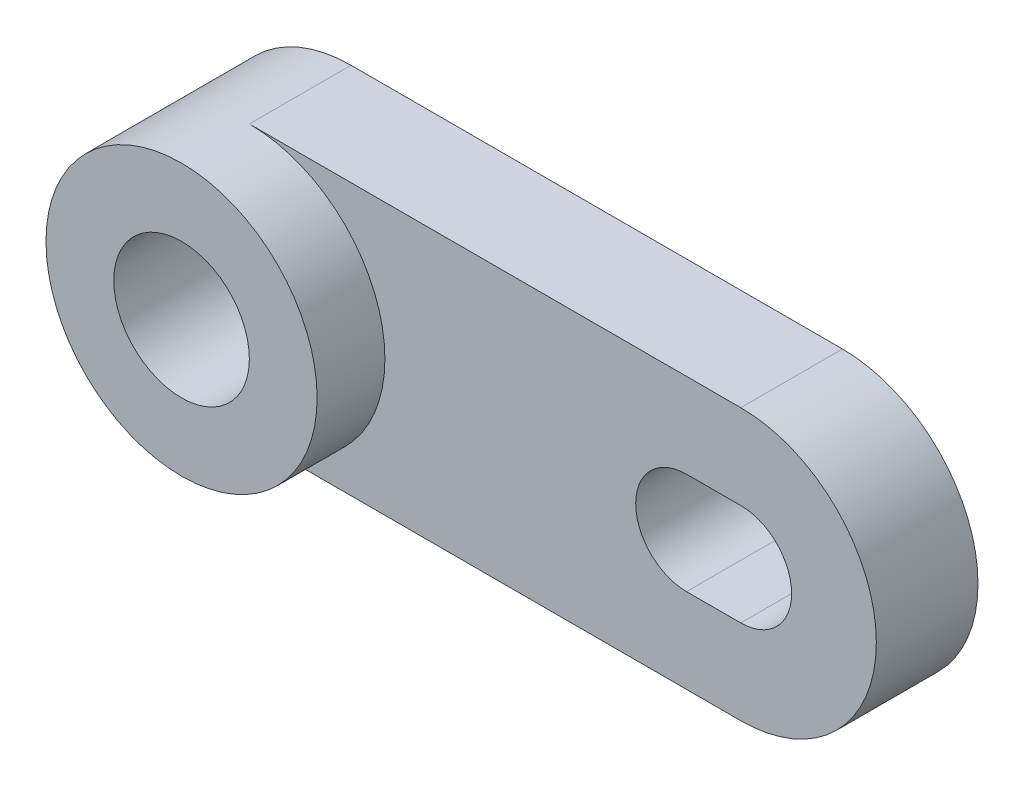
ISO-10303-21;
HEADER;
FILE_DESCRIPTION(('STEP AP214'),'2;1');
FILE_NAME('part.step','',(''),(''),'','','');
FILE_SCHEMA(('AUTOMOTIVE_DESIGN { 1 0 10303 214 1 1 1 1 }'));
ENDSEC;
DATA;
#1=APPLICATION_CONTEXT('core data for automotive mechanical design processes');
#2=APPLICATION_PROTOCOL_DEFINITION('international standard','automotive_design',2000,#1);
#3=PRODUCT_CONTEXT('',#1,'mechanical');
#4=PRODUCT('Part','Part','',(#3));
#5=PRODUCT_RELATED_PRODUCT_CATEGORY('part','',(#4));
#6=PRODUCT_DEFINITION_FORMATION('','',#4);
#7=PRODUCT_DEFINITION_CONTEXT('part definition',#1,'design');
#8=PRODUCT_DEFINITION('design','',#6,#7);
#9=PRODUCT_DEFINITION_SHAPE('','',#8);
#10=(LENGTH_UNIT() NAMED_UNIT(*) SI_UNIT(.MILLI.,.METRE.));
#11=(NAMED_UNIT(*) PLANE_ANGLE_UNIT() SI_UNIT($,.RADIAN.));
#12=(NAMED_UNIT(*) SI_UNIT($,.STERADIAN.) SOLID_ANGLE_UNIT());
#13=UNCERTAINTY_MEASURE_WITH_UNIT(LENGTH_MEASURE(1.E-05),#10,'distance_accuracy_value','');
#14=(GEOMETRIC_REPRESENTATION_CONTEXT(3) GLOBAL_UNCERTAINTY_ASSIGNED_CONTEXT((#13)) GLOBAL_UNIT_ASSIGNED_CONTEXT((#10,
#11,#12)) REPRESENTATION_CONTEXT('',''));
#15=CARTESIAN_POINT('',(0.,0.,0.));
#16=DIRECTION('',(0.,0.,1.));
#17=DIRECTION('',(1.,0.,0.));
#18=AXIS2_PLACEMENT_3D('',#15,#16,#17);
#19=CARTESIAN_POINT('',(0.,0.,3.));
#20=DIRECTION('',(0.,0.,-1.));
#21=DIRECTION('',(-1.,0.,0.));
#22=AXIS2_PLACEMENT_3D('',#19,#20,#21);
#23=CYLINDRICAL_SURFACE('',#22,2.);
#24=CARTESIAN_POINT('',(0.,0.,5.));
#25=DIRECTION('',(0.,0.,1.));
#26=DIRECTION('',(1.,0.,0.));
#27=AXIS2_PLACEMENT_3D('',#24,#25,#26);
#28=CIRCLE('',#27,2.);
#29=CARTESIAN_POINT('',(2.,0.,5.));
#30=VERTEX_POINT('',#29);
#31=EDGE_CURVE('E321',#30,#30,#28,.T.);
#32=ORIENTED_EDGE('',*,*,#31,.T.);
#33=EDGE_LOOP('',(#32));
#34=FACE_BOUND('',#33,.T.);
#35=CARTESIAN_POINT('',(0.,0.,2.));
#36=DIRECTION('',(0.,0.,-1.));
#37=DIRECTION('',(-1.,0.,0.));
#38=AXIS2_PLACEMENT_3D('',#35,#36,#37);
#39=CIRCLE('',#38,2.);
#40=CARTESIAN_POINT('',(-2.,0.,2.));
#41=VERTEX_POINT('',#40);
#42=EDGE_CURVE('E39',#41,#41,#39,.T.);
#43=ORIENTED_EDGE('',*,*,#42,.T.);
#44=EDGE_LOOP('',(#43));
#45=FACE_BOUND('',#44,.T.);
#46=ADVANCED_FACE('F35',(#34,#45),#23,.F.);
#47=CARTESIAN_POINT('',(12.9,0.,3.));
#48=DIRECTION('',(0.,0.,-1.));
#49=DIRECTION('',(-1.,0.,0.));
#50=AXIS2_PLACEMENT_3D('',#47,#48,#49);
#51=CYLINDRICAL_SURFACE('',#50,1.5);
#52=CARTESIAN_POINT('',(12.9,0.,0.));
#53=DIRECTION('',(0.,0.,1.));
#54=DIRECTION('',(1.,0.,0.));
#55=AXIS2_PLACEMENT_3D('',#52,#53,#54);
#56=CIRCLE('',#55,1.5);
#57=CARTESIAN_POINT('',(12.9,1.5,0.));
#58=VERTEX_POINT('',#57);
#59=CARTESIAN_POINT('',(12.9,-1.5,0.));
#60=VERTEX_POINT('',#59);
#61=EDGE_CURVE('E142',#58,#60,#56,.T.);
#62=ORIENTED_EDGE('',*,*,#61,.F.);
#63=DIRECTION('',(0.,0.,-1.));
#64=VECTOR('',#63,1.);
#65=CARTESIAN_POINT('',(12.9,1.5,3.));
#66=LINE('',#65,#64);
#67=CARTESIAN_POINT('',(12.9,1.5,3.));
#68=VERTEX_POINT('',#67);
#69=EDGE_CURVE('E45',#68,#58,#66,.T.);
#70=ORIENTED_EDGE('',*,*,#69,.F.);
#71=CARTESIAN_POINT('',(12.9,0.,3.));
#72=DIRECTION('',(0.,0.,1.));
#73=DIRECTION('',(1.,0.,0.));
#74=AXIS2_PLACEMENT_3D('',#71,#72,#73);
#75=CIRCLE('',#74,1.5);
#76=CARTESIAN_POINT('',(12.9,-1.5,3.));
#77=VERTEX_POINT('',#76);
#78=EDGE_CURVE('E113',#68,#77,#75,.T.);
#79=ORIENTED_EDGE('',*,*,#78,.T.);
#80=DIRECTION('',(0.,0.,-1.));
#81=VECTOR('',#80,1.);
#82=CARTESIAN_POINT('',(12.9,-1.5,3.));
#83=LINE('',#82,#81);
#84=EDGE_CURVE('E54',#77,#60,#83,.T.);
#85=ORIENTED_EDGE('',*,*,#84,.T.);
#86=EDGE_LOOP('',(#62,#70,#79,#85));
#87=FACE_BOUND('',#86,.T.);
#88=ADVANCED_FACE('F187',(#87),#51,.F.);
#89=CARTESIAN_POINT('',(0.,1.5,3.));
#90=DIRECTION('',(0.,1.,0.));
#91=DIRECTION('',(0.,0.,1.));
#92=AXIS2_PLACEMENT_3D('',#89,#90,#91);
#93=PLANE('',#92);
#94=DIRECTION('',(1.,0.,0.));
#95=VECTOR('',#94,1.);
#96=CARTESIAN_POINT('',(0.,1.5,0.));
#97=LINE('',#96,#95);
#98=CARTESIAN_POINT('',(14.5,1.5,0.));
#99=VERTEX_POINT('',#98);
#100=EDGE_CURVE('E120',#58,#99,#97,.T.);
#101=ORIENTED_EDGE('',*,*,#100,.T.);
#102=DIRECTION('',(0.,0.,-1.));
#103=VECTOR('',#102,1.);
#104=CARTESIAN_POINT('',(14.5,1.5,3.));
#105=LINE('',#104,#103);
#106=CARTESIAN_POINT('',(14.5,1.5,3.));
#107=VERTEX_POINT('',#106);
#108=EDGE_CURVE('E117',#107,#99,#105,.T.);
#109=ORIENTED_EDGE('',*,*,#108,.F.);
#110=DIRECTION('',(1.,0.,0.));
#111=VECTOR('',#110,1.);
#112=CARTESIAN_POINT('',(0.,1.5,3.));
#113=LINE('',#112,#111);
#114=EDGE_CURVE('E107',#68,#107,#113,.T.);
#115=ORIENTED_EDGE('',*,*,#114,.F.);
#116=ORIENTED_EDGE('',*,*,#69,.T.);
#117=EDGE_LOOP('',(#101,#109,#115,#116));
#118=FACE_BOUND('',#117,.T.);
#119=ADVANCED_FACE('F118',(#118),#93,.F.);
#120=CARTESIAN_POINT('',(14.5,0.,3.));
#121=DIRECTION('',(0.,0.,-1.));
#122=DIRECTION('',(-1.,0.,0.));
#123=AXIS2_PLACEMENT_3D('',#120,#121,#122);
#124=CYLINDRICAL_SURFACE('',#123,1.5);
#125=CARTESIAN_POINT('',(14.5,0.,0.));
#126=DIRECTION('',(0.,0.,1.));
#127=DIRECTION('',(1.,0.,0.));
#128=AXIS2_PLACEMENT_3D('',#125,#126,#127);
#129=CIRCLE('',#128,1.5);
#130=CARTESIAN_POINT('',(14.5,-1.5,0.));
#131=VERTEX_POINT('',#130);
#132=EDGE_CURVE('E145',#131,#99,#129,.T.);
#133=ORIENTED_EDGE('',*,*,#132,.F.);
#134=DIRECTION('',(0.,0.,-1.));
#135=VECTOR('',#134,1.);
#136=CARTESIAN_POINT('',(14.5,-1.5,3.));
#137=LINE('',#136,#135);
#138=CARTESIAN_POINT('',(14.5,-1.5,3.));
#139=VERTEX_POINT('',#138);
#140=EDGE_CURVE('E81',#139,#131,#137,.T.);
#141=ORIENTED_EDGE('',*,*,#140,.F.);
#142=CARTESIAN_POINT('',(14.5,0.,3.));
#143=DIRECTION('',(0.,0.,1.));
#144=DIRECTION('',(1.,0.,0.));
#145=AXIS2_PLACEMENT_3D('',#142,#143,#144);
#146=CIRCLE('',#145,1.5);
#147=EDGE_CURVE('E112',#139,#107,#146,.T.);
#148=ORIENTED_EDGE('',*,*,#147,.T.);
#149=ORIENTED_EDGE('',*,*,#108,.T.);
#150=EDGE_LOOP('',(#133,#141,#148,#149));
#151=FACE_BOUND('',#150,.T.);
#152=ADVANCED_FACE('F124',(#151),#124,.F.);
#153=CARTESIAN_POINT('',(0.,4.,3.));
#154=DIRECTION('',(0.,1.,0.));
#155=DIRECTION('',(0.,0.,1.));
#156=AXIS2_PLACEMENT_3D('',#153,#154,#155);
#157=PLANE('',#156);
#158=DIRECTION('',(1.,0.,0.));
#159=VECTOR('',#158,1.);
#160=CARTESIAN_POINT('',(0.,4.,0.));
#161=LINE('',#160,#159);
#162=CARTESIAN_POINT('',(0.,4.,0.));
#163=VERTEX_POINT('',#162);
#164=CARTESIAN_POINT('',(14.5,4.,0.));
#165=VERTEX_POINT('',#164);
#166=EDGE_CURVE('E131',#163,#165,#161,.T.);
#167=ORIENTED_EDGE('',*,*,#166,.F.);
#168=DIRECTION('',(0.,0.,-1.));
#169=VECTOR('',#168,1.);
#170=CARTESIAN_POINT('',(0.,4.,3.));
#171=LINE('',#170,#169);
#172=CARTESIAN_POINT('',(0.,4.,3.));
#173=VERTEX_POINT('',#172);
#174=EDGE_CURVE('E152',#173,#163,#171,.T.);
#175=ORIENTED_EDGE('',*,*,#174,.F.);
#176=DIRECTION('',(1.,0.,0.));
#177=VECTOR('',#176,1.);
#178=CARTESIAN_POINT('',(0.,4.,3.));
#179=LINE('',#178,#177);
#180=CARTESIAN_POINT('',(14.5,4.,3.));
#181=VERTEX_POINT('',#180);
#182=EDGE_CURVE('E150',#173,#181,#179,.T.);
#183=ORIENTED_EDGE('',*,*,#182,.T.);
#184=DIRECTION('',(0.,0.,-1.));
#185=VECTOR('',#184,1.);
#186=CARTESIAN_POINT('',(14.5,4.,3.));
#187=LINE('',#186,#185);
#188=EDGE_CURVE('E127',#181,#165,#187,.T.);
#189=ORIENTED_EDGE('',*,*,#188,.T.);
#190=EDGE_LOOP('',(#167,#175,#183,#189));
#191=FACE_BOUND('',#190,.T.);
#192=ADVANCED_FACE('F37',(#191),#157,.T.);
#193=CARTESIAN_POINT('',(0.,0.,3.));
#194=DIRECTION('',(0.,0.,-1.));
#195=DIRECTION('',(-1.,0.,0.));
#196=AXIS2_PLACEMENT_3D('',#193,#194,#195);
#197=CYLINDRICAL_SURFACE('',#196,4.);
#198=CARTESIAN_POINT('',(0.,0.,0.));
#199=DIRECTION('',(0.,0.,1.));
#200=DIRECTION('',(1.,0.,0.));
#201=AXIS2_PLACEMENT_3D('',#198,#199,#200);
#202=CIRCLE('',#201,4.);
#203=CARTESIAN_POINT('',(0.,-4.,0.));
#204=VERTEX_POINT('',#203);
#205=EDGE_CURVE('E134',#163,#204,#202,.T.);
#206=ORIENTED_EDGE('',*,*,#205,.T.);
#207=DIRECTION('',(0.,0.,-1.));
#208=VECTOR('',#207,1.);
#209=CARTESIAN_POINT('',(0.,-4.,3.));
#210=LINE('',#209,#208);
#211=CARTESIAN_POINT('',(0.,-4.,3.));
#212=VERTEX_POINT('',#211);
#213=EDGE_CURVE('E159',#212,#204,#210,.T.);
#214=ORIENTED_EDGE('',*,*,#213,.F.);
#215=CARTESIAN_POINT('',(0.,0.,3.));
#216=DIRECTION('',(0.,0.,1.));
#217=DIRECTION('',(1.,0.,0.));
#218=AXIS2_PLACEMENT_3D('',#215,#216,#217);
#219=CIRCLE('',#218,4.);
#220=EDGE_CURVE('E11',#212,#173,#219,.T.);
#221=ORIENTED_EDGE('',*,*,#220,.T.);
#222=ORIENTED_EDGE('',*,*,#174,.T.);
#223=EDGE_LOOP('',(#206,#214,#221,#222));
#224=FACE_BOUND('',#223,.T.);
#225=CARTESIAN_POINT('',(0.,0.,5.));
#226=DIRECTION('',(0.,0.,1.));
#227=DIRECTION('',(1.,0.,0.));
#228=AXIS2_PLACEMENT_3D('',#225,#226,#227);
#229=CIRCLE('',#228,4.);
#230=CARTESIAN_POINT('',(4.,0.,5.));
#231=VERTEX_POINT('',#230);
#232=EDGE_CURVE('E135',#231,#231,#229,.T.);
#233=ORIENTED_EDGE('',*,*,#232,.F.);
#234=EDGE_LOOP('',(#233));
#235=FACE_BOUND('',#234,.T.);
#236=ADVANCED_FACE('F164',(#224,#235),#197,.T.);
#237=CARTESIAN_POINT('',(0.,-4.,3.));
#238=DIRECTION('',(0.,1.,0.));
#239=DIRECTION('',(0.,0.,1.));
#240=AXIS2_PLACEMENT_3D('',#237,#238,#239);
#241=PLANE('',#240);
#242=DIRECTION('',(1.,0.,0.));
#243=VECTOR('',#242,1.);
#244=CARTESIAN_POINT('',(0.,-4.,0.));
#245=LINE('',#244,#243);
#246=CARTESIAN_POINT('',(14.5,-4.,0.));
#247=VERTEX_POINT('',#246);
#248=EDGE_CURVE('E137',#204,#247,#245,.T.);
#249=ORIENTED_EDGE('',*,*,#248,.T.);
#250=DIRECTION('',(0.,0.,-1.));
#251=VECTOR('',#250,1.);
#252=CARTESIAN_POINT('',(14.5,-4.,3.));
#253=LINE('',#252,#251);
#254=CARTESIAN_POINT('',(14.5,-4.,3.));
#255=VERTEX_POINT('',#254);
#256=EDGE_CURVE('E156',#255,#247,#253,.T.);
#257=ORIENTED_EDGE('',*,*,#256,.F.);
#258=DIRECTION('',(1.,0.,0.));
#259=VECTOR('',#258,1.);
#260=CARTESIAN_POINT('',(0.,-4.,3.));
#261=LINE('',#260,#259);
#262=EDGE_CURVE('E183',#212,#255,#261,.T.);
#263=ORIENTED_EDGE('',*,*,#262,.F.);
#264=ORIENTED_EDGE('',*,*,#213,.T.);
#265=EDGE_LOOP('',(#249,#257,#263,#264));
#266=FACE_BOUND('',#265,.T.);
#267=ADVANCED_FACE('F182',(#266),#241,.F.);
#268=CARTESIAN_POINT('',(14.5,0.,3.));
#269=DIRECTION('',(0.,0.,-1.));
#270=DIRECTION('',(-1.,0.,0.));
#271=AXIS2_PLACEMENT_3D('',#268,#269,#270);
#272=CYLINDRICAL_SURFACE('',#271,4.);
#273=CARTESIAN_POINT('',(14.5,0.,0.));
#274=DIRECTION('',(0.,0.,1.));
#275=DIRECTION('',(1.,0.,0.));
#276=AXIS2_PLACEMENT_3D('',#273,#274,#275);
#277=CIRCLE('',#276,4.);
#278=EDGE_CURVE('E139',#247,#165,#277,.T.);
#279=ORIENTED_EDGE('',*,*,#278,.T.);
#280=ORIENTED_EDGE('',*,*,#188,.F.);
#281=CARTESIAN_POINT('',(14.5,0.,3.));
#282=DIRECTION('',(0.,0.,1.));
#283=DIRECTION('',(1.,0.,0.));
#284=AXIS2_PLACEMENT_3D('',#281,#282,#283);
#285=CIRCLE('',#284,4.);
#286=EDGE_CURVE('E179',#255,#181,#285,.T.);
#287=ORIENTED_EDGE('',*,*,#286,.F.);
#288=ORIENTED_EDGE('',*,*,#256,.T.);
#289=EDGE_LOOP('',(#279,#280,#287,#288));
#290=FACE_BOUND('',#289,.T.);
#291=ADVANCED_FACE('F177',(#290),#272,.T.);
#292=CARTESIAN_POINT('',(0.,-1.5,3.));
#293=DIRECTION('',(0.,1.,0.));
#294=DIRECTION('',(0.,0.,1.));
#295=AXIS2_PLACEMENT_3D('',#292,#293,#294);
#296=PLANE('',#295);
#297=DIRECTION('',(1.,0.,0.));
#298=VECTOR('',#297,1.);
#299=CARTESIAN_POINT('',(0.,-1.5,0.));
#300=LINE('',#299,#298);
#301=EDGE_CURVE('E147',#60,#131,#300,.T.);
#302=ORIENTED_EDGE('',*,*,#301,.F.);
#303=ORIENTED_EDGE('',*,*,#84,.F.);
#304=DIRECTION('',(1.,0.,0.));
#305=VECTOR('',#304,1.);
#306=CARTESIAN_POINT('',(0.,-1.5,3.));
#307=LINE('',#306,#305);
#308=EDGE_CURVE('E125',#77,#139,#307,.T.);
#309=ORIENTED_EDGE('',*,*,#308,.T.);
#310=ORIENTED_EDGE('',*,*,#140,.T.);
#311=EDGE_LOOP('',(#302,#303,#309,#310));
#312=FACE_BOUND('',#311,.T.);
#313=ADVANCED_FACE('F188',(#312),#296,.T.);
#314=CARTESIAN_POINT('',(0.,0.,3.));
#315=DIRECTION('',(0.,0.,1.));
#316=DIRECTION('',(1.,0.,0.));
#317=AXIS2_PLACEMENT_3D('',#314,#315,#316);
#318=PLANE('',#317);
#319=ORIENTED_EDGE('',*,*,#220,.F.);
#320=ORIENTED_EDGE('',*,*,#262,.T.);
#321=ORIENTED_EDGE('',*,*,#286,.T.);
#322=ORIENTED_EDGE('',*,*,#182,.F.);
#323=EDGE_LOOP('',(#319,#320,#321,#322));
#324=FACE_BOUND('',#323,.T.);
#325=ORIENTED_EDGE('',*,*,#78,.F.);
#326=ORIENTED_EDGE('',*,*,#114,.T.);
#327=ORIENTED_EDGE('',*,*,#147,.F.);
#328=ORIENTED_EDGE('',*,*,#308,.F.);
#329=EDGE_LOOP('',(#325,#326,#327,#328));
#330=FACE_BOUND('',#329,.T.);
#331=ADVANCED_FACE('F109',(#324,#330),#318,.T.);
#332=CARTESIAN_POINT('',(0.,0.,0.));
#333=DIRECTION('',(0.,0.,1.));
#334=DIRECTION('',(1.,0.,0.));
#335=AXIS2_PLACEMENT_3D('',#332,#333,#334);
#336=PLANE('',#335);
#337=CARTESIAN_POINT('',(0.,0.,0.));
#338=DIRECTION('',(0.,0.,-1.));
#339=DIRECTION('',(-1.,0.,0.));
#340=AXIS2_PLACEMENT_3D('',#337,#338,#339);
#341=CIRCLE('',#340,2.5);
#342=CARTESIAN_POINT('',(-2.5,0.,0.));
#343=VERTEX_POINT('',#342);
#344=EDGE_CURVE('E327',#343,#343,#341,.T.);
#345=ORIENTED_EDGE('',*,*,#344,.F.);
#346=EDGE_LOOP('',(#345));
#347=FACE_BOUND('',#346,.T.);
#348=ORIENTED_EDGE('',*,*,#166,.T.);
#349=ORIENTED_EDGE('',*,*,#278,.F.);
#350=ORIENTED_EDGE('',*,*,#248,.F.);
#351=ORIENTED_EDGE('',*,*,#205,.F.);
#352=EDGE_LOOP('',(#348,#349,#350,#351));
#353=FACE_BOUND('',#352,.T.);
#354=ORIENTED_EDGE('',*,*,#61,.T.);
#355=ORIENTED_EDGE('',*,*,#301,.T.);
#356=ORIENTED_EDGE('',*,*,#132,.T.);
#357=ORIENTED_EDGE('',*,*,#100,.F.);
#358=EDGE_LOOP('',(#354,#355,#356,#357));
#359=FACE_BOUND('',#358,.T.);
#360=ADVANCED_FACE('F171',(#347,#353,#359),#336,.F.);
#361=CARTESIAN_POINT('',(0.,0.,5.));
#362=DIRECTION('',(0.,0.,1.));
#363=DIRECTION('',(1.,0.,0.));
#364=AXIS2_PLACEMENT_3D('',#361,#362,#363);
#365=PLANE('',#364);
#366=ORIENTED_EDGE('',*,*,#232,.T.);
#367=EDGE_LOOP('',(#366));
#368=FACE_BOUND('',#367,.T.);
#369=ORIENTED_EDGE('',*,*,#31,.F.);
#370=EDGE_LOOP('',(#369));
#371=FACE_BOUND('',#370,.T.);
#372=ADVANCED_FACE('F280',(#368,#371),#365,.T.);
#373=CARTESIAN_POINT('',(0.,0.,2.));
#374=DIRECTION('',(0.,0.,-1.));
#375=DIRECTION('',(-1.,0.,0.));
#376=AXIS2_PLACEMENT_3D('',#373,#374,#375);
#377=CYLINDRICAL_SURFACE('',#376,2.5);
#378=CARTESIAN_POINT('',(0.,0.,2.));
#379=DIRECTION('',(0.,0.,-1.));
#380=DIRECTION('',(-1.,0.,0.));
#381=AXIS2_PLACEMENT_3D('',#378,#379,#380);
#382=CIRCLE('',#381,2.5);
#383=CARTESIAN_POINT('',(-2.5,0.,2.));
#384=VERTEX_POINT('',#383);
#385=EDGE_CURVE('E325',#384,#384,#382,.T.);
#386=ORIENTED_EDGE('',*,*,#385,.F.);
#387=EDGE_LOOP('',(#386));
#388=FACE_BOUND('',#387,.T.);
#389=ORIENTED_EDGE('',*,*,#344,.T.);
#390=EDGE_LOOP('',(#389));
#391=FACE_BOUND('',#390,.T.);
#392=ADVANCED_FACE('F293',(#388,#391),#377,.F.);
#393=CARTESIAN_POINT('',(0.,0.,2.));
#394=DIRECTION('',(0.,0.,-1.));
#395=DIRECTION('',(-1.,0.,0.));
#396=AXIS2_PLACEMENT_3D('',#393,#394,#395);
#397=PLANE('',#396);
#398=ORIENTED_EDGE('',*,*,#42,.F.);
#399=EDGE_LOOP('',(#398));
#400=FACE_BOUND('',#399,.T.);
#401=ORIENTED_EDGE('',*,*,#385,.T.);
#402=EDGE_LOOP('',(#401));
#403=FACE_BOUND('',#402,.T.);
#404=ADVANCED_FACE('F298',(#400,#403),#397,.T.);
#405=CLOSED_SHELL('',(#46,#88,#119,#152,#192,#236,#267,#291,#313,#331,#360,#372,#392,#404));
#406=MANIFOLD_SOLID_BREP('B2',#405);
#407=ADVANCED_BREP_SHAPE_REPRESENTATION('',(#18,#406),#14);
#408=SHAPE_DEFINITION_REPRESENTATION(#9,#407);
ENDSEC;
END-ISO-10303-21;
